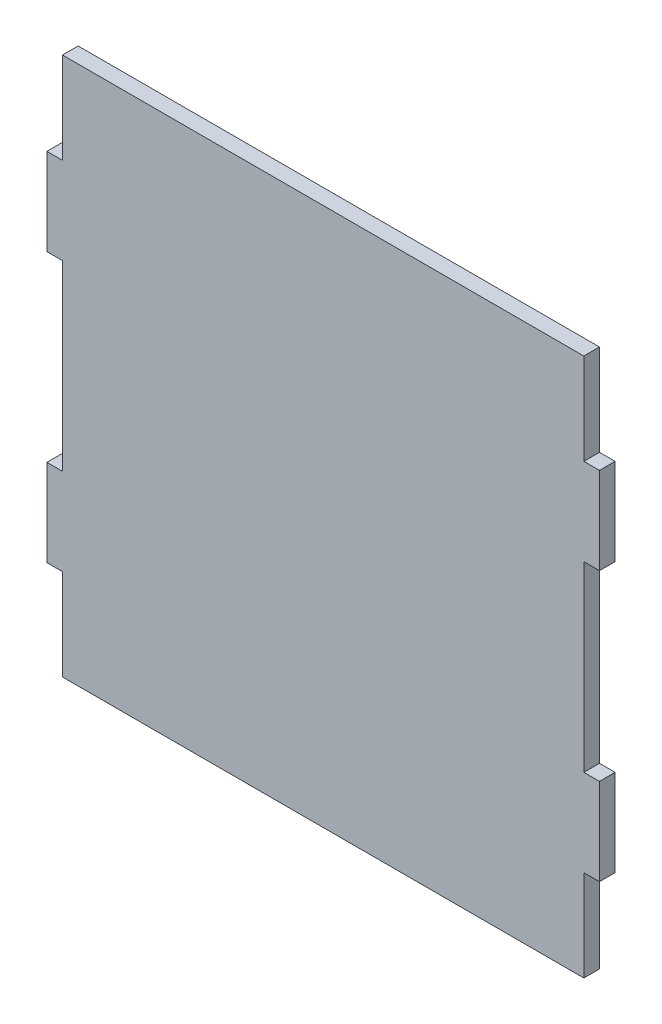
ISO-10303-21;
HEADER;
FILE_DESCRIPTION(('STEP AP214'),'2;1');
FILE_NAME('part.step','',(''),(''),'','','');
FILE_SCHEMA(('AUTOMOTIVE_DESIGN { 1 0 10303 214 1 1 1 1 }'));
ENDSEC;
DATA;
#1=APPLICATION_CONTEXT('core data for automotive mechanical design processes');
#2=APPLICATION_PROTOCOL_DEFINITION('international standard','automotive_design',2000,#1);
#3=PRODUCT_CONTEXT('',#1,'mechanical');
#4=PRODUCT('Part','Part','',(#3));
#5=PRODUCT_RELATED_PRODUCT_CATEGORY('part','',(#4));
#6=PRODUCT_DEFINITION_FORMATION('','',#4);
#7=PRODUCT_DEFINITION_CONTEXT('part definition',#1,'design');
#8=PRODUCT_DEFINITION('design','',#6,#7);
#9=PRODUCT_DEFINITION_SHAPE('','',#8);
#10=(LENGTH_UNIT() NAMED_UNIT(*) SI_UNIT(.MILLI.,.METRE.));
#11=(NAMED_UNIT(*) PLANE_ANGLE_UNIT() SI_UNIT($,.RADIAN.));
#12=(NAMED_UNIT(*) SI_UNIT($,.STERADIAN.) SOLID_ANGLE_UNIT());
#13=UNCERTAINTY_MEASURE_WITH_UNIT(LENGTH_MEASURE(1.E-05),#10,'distance_accuracy_value','');
#14=(GEOMETRIC_REPRESENTATION_CONTEXT(3) GLOBAL_UNCERTAINTY_ASSIGNED_CONTEXT((#13)) GLOBAL_UNIT_ASSIGNED_CONTEXT((#10,
#11,#12)) REPRESENTATION_CONTEXT('',''));
#15=CARTESIAN_POINT('',(0.,0.,0.));
#16=DIRECTION('',(0.,0.,1.));
#17=DIRECTION('',(1.,0.,0.));
#18=AXIS2_PLACEMENT_3D('',#15,#16,#17);
#19=CARTESIAN_POINT('',(0.,0.,18.));
#20=DIRECTION('',(1.,0.,0.));
#21=DIRECTION('',(0.,1.,0.));
#22=AXIS2_PLACEMENT_3D('',#19,#20,#21);
#23=PLANE('',#22);
#24=DIRECTION('',(0.,-1.,0.));
#25=VECTOR('',#24,1.);
#26=CARTESIAN_POINT('',(0.,0.,0.));
#27=LINE('',#26,#25);
#28=CARTESIAN_POINT('',(0.,0.,0.));
#29=VERTEX_POINT('',#28);
#30=CARTESIAN_POINT('',(0.,-105.,0.));
#31=VERTEX_POINT('',#30);
#32=EDGE_CURVE('E199',#29,#31,#27,.T.);
#33=ORIENTED_EDGE('',*,*,#32,.T.);
#34=DIRECTION('',(0.,0.,-1.));
#35=VECTOR('',#34,1.);
#36=CARTESIAN_POINT('',(0.,-105.,18.));
#37=LINE('',#36,#35);
#38=CARTESIAN_POINT('',(0.,-105.,18.));
#39=VERTEX_POINT('',#38);
#40=EDGE_CURVE('E11',#39,#31,#37,.T.);
#41=ORIENTED_EDGE('',*,*,#40,.F.);
#42=DIRECTION('',(0.,-1.,0.));
#43=VECTOR('',#42,1.);
#44=CARTESIAN_POINT('',(0.,0.,18.));
#45=LINE('',#44,#43);
#46=CARTESIAN_POINT('',(0.,0.,18.));
#47=VERTEX_POINT('',#46);
#48=EDGE_CURVE('E121',#47,#39,#45,.T.);
#49=ORIENTED_EDGE('',*,*,#48,.F.);
#50=DIRECTION('',(0.,0.,-1.));
#51=VECTOR('',#50,1.);
#52=CARTESIAN_POINT('',(0.,0.,18.));
#53=LINE('',#52,#51);
#54=EDGE_CURVE('E48',#47,#29,#53,.T.);
#55=ORIENTED_EDGE('',*,*,#54,.T.);
#56=EDGE_LOOP('',(#33,#41,#49,#55));
#57=FACE_BOUND('',#56,.T.);
#58=ADVANCED_FACE('F32',(#57),#23,.F.);
#59=CARTESIAN_POINT('',(-18.,-105.,18.));
#60=DIRECTION('',(0.,1.,0.));
#61=DIRECTION('',(0.,0.,1.));
#62=AXIS2_PLACEMENT_3D('',#59,#60,#61);
#63=PLANE('',#62);
#64=DIRECTION('',(1.,0.,0.));
#65=VECTOR('',#64,1.);
#66=CARTESIAN_POINT('',(-18.,-105.,0.));
#67=LINE('',#66,#65);
#68=CARTESIAN_POINT('',(-18.,-105.,0.));
#69=VERTEX_POINT('',#68);
#70=EDGE_CURVE('E201',#69,#31,#67,.T.);
#71=ORIENTED_EDGE('',*,*,#70,.F.);
#72=DIRECTION('',(0.,0.,-1.));
#73=VECTOR('',#72,1.);
#74=CARTESIAN_POINT('',(-18.,-105.,18.));
#75=LINE('',#74,#73);
#76=CARTESIAN_POINT('',(-18.,-105.,18.));
#77=VERTEX_POINT('',#76);
#78=EDGE_CURVE('E40',#77,#69,#75,.T.);
#79=ORIENTED_EDGE('',*,*,#78,.F.);
#80=DIRECTION('',(1.,0.,0.));
#81=VECTOR('',#80,1.);
#82=CARTESIAN_POINT('',(-18.,-105.,18.));
#83=LINE('',#82,#81);
#84=EDGE_CURVE('E299',#77,#39,#83,.T.);
#85=ORIENTED_EDGE('',*,*,#84,.T.);
#86=ORIENTED_EDGE('',*,*,#40,.T.);
#87=EDGE_LOOP('',(#71,#79,#85,#86));
#88=FACE_BOUND('',#87,.T.);
#89=ADVANCED_FACE('F298',(#88),#63,.T.);
#90=CARTESIAN_POINT('',(-18.,-105.,18.));
#91=DIRECTION('',(1.,0.,0.));
#92=DIRECTION('',(0.,1.,0.));
#93=AXIS2_PLACEMENT_3D('',#90,#91,#92);
#94=PLANE('',#93);
#95=DIRECTION('',(0.,-1.,0.));
#96=VECTOR('',#95,1.);
#97=CARTESIAN_POINT('',(-18.,-105.,0.));
#98=LINE('',#97,#96);
#99=CARTESIAN_POINT('',(-18.,-205.,0.));
#100=VERTEX_POINT('',#99);
#101=EDGE_CURVE('E204',#69,#100,#98,.T.);
#102=ORIENTED_EDGE('',*,*,#101,.T.);
#103=DIRECTION('',(0.,0.,-1.));
#104=VECTOR('',#103,1.);
#105=CARTESIAN_POINT('',(-18.,-205.,18.));
#106=LINE('',#105,#104);
#107=CARTESIAN_POINT('',(-18.,-205.,18.));
#108=VERTEX_POINT('',#107);
#109=EDGE_CURVE('E283',#108,#100,#106,.T.);
#110=ORIENTED_EDGE('',*,*,#109,.F.);
#111=DIRECTION('',(0.,-1.,0.));
#112=VECTOR('',#111,1.);
#113=CARTESIAN_POINT('',(-18.,-105.,18.));
#114=LINE('',#113,#112);
#115=EDGE_CURVE('E290',#77,#108,#114,.T.);
#116=ORIENTED_EDGE('',*,*,#115,.F.);
#117=ORIENTED_EDGE('',*,*,#78,.T.);
#118=EDGE_LOOP('',(#102,#110,#116,#117));
#119=FACE_BOUND('',#118,.T.);
#120=ADVANCED_FACE('F288',(#119),#94,.F.);
#121=CARTESIAN_POINT('',(-18.,-205.,18.));
#122=DIRECTION('',(0.,1.,0.));
#123=DIRECTION('',(0.,0.,1.));
#124=AXIS2_PLACEMENT_3D('',#121,#122,#123);
#125=PLANE('',#124);
#126=DIRECTION('',(1.,0.,0.));
#127=VECTOR('',#126,1.);
#128=CARTESIAN_POINT('',(-18.,-205.,0.));
#129=LINE('',#128,#127);
#130=CARTESIAN_POINT('',(0.,-205.,0.));
#131=VERTEX_POINT('',#130);
#132=EDGE_CURVE('E206',#100,#131,#129,.T.);
#133=ORIENTED_EDGE('',*,*,#132,.T.);
#134=DIRECTION('',(0.,0.,-1.));
#135=VECTOR('',#134,1.);
#136=CARTESIAN_POINT('',(0.,-205.,18.));
#137=LINE('',#136,#135);
#138=CARTESIAN_POINT('',(0.,-205.,18.));
#139=VERTEX_POINT('',#138);
#140=EDGE_CURVE('E280',#139,#131,#137,.T.);
#141=ORIENTED_EDGE('',*,*,#140,.F.);
#142=DIRECTION('',(1.,0.,0.));
#143=VECTOR('',#142,1.);
#144=CARTESIAN_POINT('',(-18.,-205.,18.));
#145=LINE('',#144,#143);
#146=EDGE_CURVE('E546',#108,#139,#145,.T.);
#147=ORIENTED_EDGE('',*,*,#146,.F.);
#148=ORIENTED_EDGE('',*,*,#109,.T.);
#149=EDGE_LOOP('',(#133,#141,#147,#148));
#150=FACE_BOUND('',#149,.T.);
#151=ADVANCED_FACE('F317',(#150),#125,.F.);
#152=CARTESIAN_POINT('',(0.,-205.,18.));
#153=DIRECTION('',(1.,0.,0.));
#154=DIRECTION('',(0.,1.,0.));
#155=AXIS2_PLACEMENT_3D('',#152,#153,#154);
#156=PLANE('',#155);
#157=DIRECTION('',(0.,-1.,0.));
#158=VECTOR('',#157,1.);
#159=CARTESIAN_POINT('',(0.,-205.,0.));
#160=LINE('',#159,#158);
#161=CARTESIAN_POINT('',(0.,-415.,0.));
#162=VERTEX_POINT('',#161);
#163=EDGE_CURVE('E208',#131,#162,#160,.T.);
#164=ORIENTED_EDGE('',*,*,#163,.T.);
#165=DIRECTION('',(0.,0.,-1.));
#166=VECTOR('',#165,1.);
#167=CARTESIAN_POINT('',(0.,-415.,18.));
#168=LINE('',#167,#166);
#169=CARTESIAN_POINT('',(0.,-415.,18.));
#170=VERTEX_POINT('',#169);
#171=EDGE_CURVE('E278',#170,#162,#168,.T.);
#172=ORIENTED_EDGE('',*,*,#171,.F.);
#173=DIRECTION('',(0.,-1.,0.));
#174=VECTOR('',#173,1.);
#175=CARTESIAN_POINT('',(0.,-205.,18.));
#176=LINE('',#175,#174);
#177=EDGE_CURVE('E544',#139,#170,#176,.T.);
#178=ORIENTED_EDGE('',*,*,#177,.F.);
#179=ORIENTED_EDGE('',*,*,#140,.T.);
#180=EDGE_LOOP('',(#164,#172,#178,#179));
#181=FACE_BOUND('',#180,.T.);
#182=ADVANCED_FACE('F322',(#181),#156,.F.);
#183=CARTESIAN_POINT('',(-18.,-415.,18.));
#184=DIRECTION('',(0.,1.,0.));
#185=DIRECTION('',(0.,0.,1.));
#186=AXIS2_PLACEMENT_3D('',#183,#184,#185);
#187=PLANE('',#186);
#188=DIRECTION('',(1.,0.,0.));
#189=VECTOR('',#188,1.);
#190=CARTESIAN_POINT('',(-18.,-415.,0.));
#191=LINE('',#190,#189);
#192=CARTESIAN_POINT('',(-18.,-415.,0.));
#193=VERTEX_POINT('',#192);
#194=EDGE_CURVE('E211',#193,#162,#191,.T.);
#195=ORIENTED_EDGE('',*,*,#194,.F.);
#196=DIRECTION('',(0.,0.,-1.));
#197=VECTOR('',#196,1.);
#198=CARTESIAN_POINT('',(-18.,-415.,18.));
#199=LINE('',#198,#197);
#200=CARTESIAN_POINT('',(-18.,-415.,18.));
#201=VERTEX_POINT('',#200);
#202=EDGE_CURVE('E276',#201,#193,#199,.T.);
#203=ORIENTED_EDGE('',*,*,#202,.F.);
#204=DIRECTION('',(1.,0.,0.));
#205=VECTOR('',#204,1.);
#206=CARTESIAN_POINT('',(-18.,-415.,18.));
#207=LINE('',#206,#205);
#208=EDGE_CURVE('E548',#201,#170,#207,.T.);
#209=ORIENTED_EDGE('',*,*,#208,.T.);
#210=ORIENTED_EDGE('',*,*,#171,.T.);
#211=EDGE_LOOP('',(#195,#203,#209,#210));
#212=FACE_BOUND('',#211,.T.);
#213=ADVANCED_FACE('F326',(#212),#187,.T.);
#214=CARTESIAN_POINT('',(-18.,-515.,18.));
#215=DIRECTION('',(-1.,0.,0.));
#216=DIRECTION('',(0.,0.,1.));
#217=AXIS2_PLACEMENT_3D('',#214,#215,#216);
#218=PLANE('',#217);
#219=DIRECTION('',(0.,1.,0.));
#220=VECTOR('',#219,1.);
#221=CARTESIAN_POINT('',(-18.,-515.,0.));
#222=LINE('',#221,#220);
#223=CARTESIAN_POINT('',(-18.,-515.,0.));
#224=VERTEX_POINT('',#223);
#225=EDGE_CURVE('E214',#224,#193,#222,.T.);
#226=ORIENTED_EDGE('',*,*,#225,.F.);
#227=DIRECTION('',(0.,0.,-1.));
#228=VECTOR('',#227,1.);
#229=CARTESIAN_POINT('',(-18.,-515.,18.));
#230=LINE('',#229,#228);
#231=CARTESIAN_POINT('',(-18.,-515.,18.));
#232=VERTEX_POINT('',#231);
#233=EDGE_CURVE('E274',#232,#224,#230,.T.);
#234=ORIENTED_EDGE('',*,*,#233,.F.);
#235=DIRECTION('',(0.,1.,0.));
#236=VECTOR('',#235,1.);
#237=CARTESIAN_POINT('',(-18.,-515.,18.));
#238=LINE('',#237,#236);
#239=EDGE_CURVE('E538',#232,#201,#238,.T.);
#240=ORIENTED_EDGE('',*,*,#239,.T.);
#241=ORIENTED_EDGE('',*,*,#202,.T.);
#242=EDGE_LOOP('',(#226,#234,#240,#241));
#243=FACE_BOUND('',#242,.T.);
#244=ADVANCED_FACE('F330',(#243),#218,.T.);
#245=CARTESIAN_POINT('',(-18.,-515.,18.));
#246=DIRECTION('',(0.,1.,0.));
#247=DIRECTION('',(0.,0.,1.));
#248=AXIS2_PLACEMENT_3D('',#245,#246,#247);
#249=PLANE('',#248);
#250=DIRECTION('',(1.,0.,0.));
#251=VECTOR('',#250,1.);
#252=CARTESIAN_POINT('',(-18.,-515.,0.));
#253=LINE('',#252,#251);
#254=CARTESIAN_POINT('',(0.,-515.,0.));
#255=VERTEX_POINT('',#254);
#256=EDGE_CURVE('E217',#224,#255,#253,.T.);
#257=ORIENTED_EDGE('',*,*,#256,.T.);
#258=DIRECTION('',(0.,0.,-1.));
#259=VECTOR('',#258,1.);
#260=CARTESIAN_POINT('',(0.,-515.,18.));
#261=LINE('',#260,#259);
#262=CARTESIAN_POINT('',(0.,-515.,18.));
#263=VERTEX_POINT('',#262);
#264=EDGE_CURVE('E272',#263,#255,#261,.T.);
#265=ORIENTED_EDGE('',*,*,#264,.F.);
#266=DIRECTION('',(1.,0.,0.));
#267=VECTOR('',#266,1.);
#268=CARTESIAN_POINT('',(-18.,-515.,18.));
#269=LINE('',#268,#267);
#270=EDGE_CURVE('E555',#232,#263,#269,.T.);
#271=ORIENTED_EDGE('',*,*,#270,.F.);
#272=ORIENTED_EDGE('',*,*,#233,.T.);
#273=EDGE_LOOP('',(#257,#265,#271,#272));
#274=FACE_BOUND('',#273,.T.);
#275=ADVANCED_FACE('F334',(#274),#249,.F.);
#276=CARTESIAN_POINT('',(0.,-620.,18.));
#277=DIRECTION('',(-1.,0.,0.));
#278=DIRECTION('',(0.,-1.,0.));
#279=AXIS2_PLACEMENT_3D('',#276,#277,#278);
#280=PLANE('',#279);
#281=DIRECTION('',(0.,1.,0.));
#282=VECTOR('',#281,1.);
#283=CARTESIAN_POINT('',(0.,-620.,0.));
#284=LINE('',#283,#282);
#285=CARTESIAN_POINT('',(0.,-620.,0.));
#286=VERTEX_POINT('',#285);
#287=EDGE_CURVE('E220',#286,#255,#284,.T.);
#288=ORIENTED_EDGE('',*,*,#287,.F.);
#289=DIRECTION('',(0.,0.,-1.));
#290=VECTOR('',#289,1.);
#291=CARTESIAN_POINT('',(0.,-620.,18.));
#292=LINE('',#291,#290);
#293=CARTESIAN_POINT('',(0.,-620.,18.));
#294=VERTEX_POINT('',#293);
#295=EDGE_CURVE('E270',#294,#286,#292,.T.);
#296=ORIENTED_EDGE('',*,*,#295,.F.);
#297=DIRECTION('',(0.,1.,0.));
#298=VECTOR('',#297,1.);
#299=CARTESIAN_POINT('',(0.,-620.,18.));
#300=LINE('',#299,#298);
#301=EDGE_CURVE('E532',#294,#263,#300,.T.);
#302=ORIENTED_EDGE('',*,*,#301,.T.);
#303=ORIENTED_EDGE('',*,*,#264,.T.);
#304=EDGE_LOOP('',(#288,#296,#302,#303));
#305=FACE_BOUND('',#304,.T.);
#306=ADVANCED_FACE('F338',(#305),#280,.T.);
#307=CARTESIAN_POINT('',(0.,-620.,18.));
#308=DIRECTION('',(0.,1.,0.));
#309=DIRECTION('',(-1.,0.,0.));
#310=AXIS2_PLACEMENT_3D('',#307,#308,#309);
#311=PLANE('',#310);
#312=DIRECTION('',(1.,0.,0.));
#313=VECTOR('',#312,1.);
#314=CARTESIAN_POINT('',(0.,-620.,0.));
#315=LINE('',#314,#313);
#316=CARTESIAN_POINT('',(600.,-620.,0.));
#317=VERTEX_POINT('',#316);
#318=EDGE_CURVE('E223',#286,#317,#315,.T.);
#319=ORIENTED_EDGE('',*,*,#318,.T.);
#320=DIRECTION('',(0.,0.,-1.));
#321=VECTOR('',#320,1.);
#322=CARTESIAN_POINT('',(600.,-620.,18.));
#323=LINE('',#322,#321);
#324=CARTESIAN_POINT('',(600.,-620.,18.));
#325=VERTEX_POINT('',#324);
#326=EDGE_CURVE('E267',#325,#317,#323,.T.);
#327=ORIENTED_EDGE('',*,*,#326,.F.);
#328=DIRECTION('',(1.,0.,0.));
#329=VECTOR('',#328,1.);
#330=CARTESIAN_POINT('',(0.,-620.,18.));
#331=LINE('',#330,#329);
#332=EDGE_CURVE('E558',#294,#325,#331,.T.);
#333=ORIENTED_EDGE('',*,*,#332,.F.);
#334=ORIENTED_EDGE('',*,*,#295,.T.);
#335=EDGE_LOOP('',(#319,#327,#333,#334));
#336=FACE_BOUND('',#335,.T.);
#337=ADVANCED_FACE('F342',(#336),#311,.F.);
#338=CARTESIAN_POINT('',(600.,-620.,18.));
#339=DIRECTION('',(-1.,0.,0.));
#340=DIRECTION('',(0.,0.,1.));
#341=AXIS2_PLACEMENT_3D('',#338,#339,#340);
#342=PLANE('',#341);
#343=DIRECTION('',(0.,1.,0.));
#344=VECTOR('',#343,1.);
#345=CARTESIAN_POINT('',(600.,-620.,0.));
#346=LINE('',#345,#344);
#347=CARTESIAN_POINT('',(600.,-515.,0.));
#348=VERTEX_POINT('',#347);
#349=EDGE_CURVE('E225',#317,#348,#346,.T.);
#350=ORIENTED_EDGE('',*,*,#349,.T.);
#351=DIRECTION('',(0.,0.,-1.));
#352=VECTOR('',#351,1.);
#353=CARTESIAN_POINT('',(600.,-515.,18.));
#354=LINE('',#353,#352);
#355=CARTESIAN_POINT('',(600.,-515.,18.));
#356=VERTEX_POINT('',#355);
#357=EDGE_CURVE('E265',#356,#348,#354,.T.);
#358=ORIENTED_EDGE('',*,*,#357,.F.);
#359=DIRECTION('',(0.,1.,0.));
#360=VECTOR('',#359,1.);
#361=CARTESIAN_POINT('',(600.,-620.,18.));
#362=LINE('',#361,#360);
#363=EDGE_CURVE('E560',#325,#356,#362,.T.);
#364=ORIENTED_EDGE('',*,*,#363,.F.);
#365=ORIENTED_EDGE('',*,*,#326,.T.);
#366=EDGE_LOOP('',(#350,#358,#364,#365));
#367=FACE_BOUND('',#366,.T.);
#368=ADVANCED_FACE('F346',(#367),#342,.F.);
#369=CARTESIAN_POINT('',(618.,-515.,18.));
#370=DIRECTION('',(0.,-1.,0.));
#371=DIRECTION('',(1.,0.,0.));
#372=AXIS2_PLACEMENT_3D('',#369,#370,#371);
#373=PLANE('',#372);
#374=DIRECTION('',(-1.,0.,0.));
#375=VECTOR('',#374,1.);
#376=CARTESIAN_POINT('',(618.,-515.,0.));
#377=LINE('',#376,#375);
#378=CARTESIAN_POINT('',(618.,-515.,0.));
#379=VERTEX_POINT('',#378);
#380=EDGE_CURVE('E228',#379,#348,#377,.T.);
#381=ORIENTED_EDGE('',*,*,#380,.F.);
#382=DIRECTION('',(0.,0.,-1.));
#383=VECTOR('',#382,1.);
#384=CARTESIAN_POINT('',(618.,-515.,18.));
#385=LINE('',#384,#383);
#386=CARTESIAN_POINT('',(618.,-515.,18.));
#387=VERTEX_POINT('',#386);
#388=EDGE_CURVE('E263',#387,#379,#385,.T.);
#389=ORIENTED_EDGE('',*,*,#388,.F.);
#390=DIRECTION('',(-1.,0.,0.));
#391=VECTOR('',#390,1.);
#392=CARTESIAN_POINT('',(618.,-515.,18.));
#393=LINE('',#392,#391);
#394=EDGE_CURVE('E522',#387,#356,#393,.T.);
#395=ORIENTED_EDGE('',*,*,#394,.T.);
#396=ORIENTED_EDGE('',*,*,#357,.T.);
#397=EDGE_LOOP('',(#381,#389,#395,#396));
#398=FACE_BOUND('',#397,.T.);
#399=ADVANCED_FACE('F350',(#398),#373,.T.);
#400=CARTESIAN_POINT('',(618.,-515.,18.));
#401=DIRECTION('',(-1.,0.,0.));
#402=DIRECTION('',(0.,0.,1.));
#403=AXIS2_PLACEMENT_3D('',#400,#401,#402);
#404=PLANE('',#403);
#405=DIRECTION('',(0.,1.,0.));
#406=VECTOR('',#405,1.);
#407=CARTESIAN_POINT('',(618.,-515.,0.));
#408=LINE('',#407,#406);
#409=CARTESIAN_POINT('',(618.,-415.,0.));
#410=VERTEX_POINT('',#409);
#411=EDGE_CURVE('E231',#379,#410,#408,.T.);
#412=ORIENTED_EDGE('',*,*,#411,.T.);
#413=DIRECTION('',(0.,0.,-1.));
#414=VECTOR('',#413,1.);
#415=CARTESIAN_POINT('',(618.,-415.,18.));
#416=LINE('',#415,#414);
#417=CARTESIAN_POINT('',(618.,-415.,18.));
#418=VERTEX_POINT('',#417);
#419=EDGE_CURVE('E260',#418,#410,#416,.T.);
#420=ORIENTED_EDGE('',*,*,#419,.F.);
#421=DIRECTION('',(0.,1.,0.));
#422=VECTOR('',#421,1.);
#423=CARTESIAN_POINT('',(618.,-515.,18.));
#424=LINE('',#423,#422);
#425=EDGE_CURVE('E563',#387,#418,#424,.T.);
#426=ORIENTED_EDGE('',*,*,#425,.F.);
#427=ORIENTED_EDGE('',*,*,#388,.T.);
#428=EDGE_LOOP('',(#412,#420,#426,#427));
#429=FACE_BOUND('',#428,.T.);
#430=ADVANCED_FACE('F354',(#429),#404,.F.);
#431=CARTESIAN_POINT('',(618.,-415.,18.));
#432=DIRECTION('',(0.,-1.,0.));
#433=DIRECTION('',(0.,0.,-1.));
#434=AXIS2_PLACEMENT_3D('',#431,#432,#433);
#435=PLANE('',#434);
#436=DIRECTION('',(-1.,0.,0.));
#437=VECTOR('',#436,1.);
#438=CARTESIAN_POINT('',(618.,-415.,0.));
#439=LINE('',#438,#437);
#440=CARTESIAN_POINT('',(600.,-415.,0.));
#441=VERTEX_POINT('',#440);
#442=EDGE_CURVE('E233',#410,#441,#439,.T.);
#443=ORIENTED_EDGE('',*,*,#442,.T.);
#444=DIRECTION('',(0.,0.,-1.));
#445=VECTOR('',#444,1.);
#446=CARTESIAN_POINT('',(600.,-415.,18.));
#447=LINE('',#446,#445);
#448=CARTESIAN_POINT('',(600.,-415.,18.));
#449=VERTEX_POINT('',#448);
#450=EDGE_CURVE('E258',#449,#441,#447,.T.);
#451=ORIENTED_EDGE('',*,*,#450,.F.);
#452=DIRECTION('',(-1.,0.,0.));
#453=VECTOR('',#452,1.);
#454=CARTESIAN_POINT('',(618.,-415.,18.));
#455=LINE('',#454,#453);
#456=EDGE_CURVE('E565',#418,#449,#455,.T.);
#457=ORIENTED_EDGE('',*,*,#456,.F.);
#458=ORIENTED_EDGE('',*,*,#419,.T.);
#459=EDGE_LOOP('',(#443,#451,#457,#458));
#460=FACE_BOUND('',#459,.T.);
#461=ADVANCED_FACE('F358',(#460),#435,.F.);
#462=CARTESIAN_POINT('',(600.,-205.,18.));
#463=DIRECTION('',(1.,0.,0.));
#464=DIRECTION('',(0.,1.,0.));
#465=AXIS2_PLACEMENT_3D('',#462,#463,#464);
#466=PLANE('',#465);
#467=DIRECTION('',(0.,-1.,0.));
#468=VECTOR('',#467,1.);
#469=CARTESIAN_POINT('',(600.,-205.,0.));
#470=LINE('',#469,#468);
#471=CARTESIAN_POINT('',(600.,-205.,0.));
#472=VERTEX_POINT('',#471);
#473=EDGE_CURVE('E236',#472,#441,#470,.T.);
#474=ORIENTED_EDGE('',*,*,#473,.F.);
#475=DIRECTION('',(0.,0.,-1.));
#476=VECTOR('',#475,1.);
#477=CARTESIAN_POINT('',(600.,-205.,18.));
#478=LINE('',#477,#476);
#479=CARTESIAN_POINT('',(600.,-205.,18.));
#480=VERTEX_POINT('',#479);
#481=EDGE_CURVE('E256',#480,#472,#478,.T.);
#482=ORIENTED_EDGE('',*,*,#481,.F.);
#483=DIRECTION('',(0.,-1.,0.));
#484=VECTOR('',#483,1.);
#485=CARTESIAN_POINT('',(600.,-205.,18.));
#486=LINE('',#485,#484);
#487=EDGE_CURVE('E512',#480,#449,#486,.T.);
#488=ORIENTED_EDGE('',*,*,#487,.T.);
#489=ORIENTED_EDGE('',*,*,#450,.T.);
#490=EDGE_LOOP('',(#474,#482,#488,#489));
#491=FACE_BOUND('',#490,.T.);
#492=ADVANCED_FACE('F362',(#491),#466,.T.);
#493=CARTESIAN_POINT('',(618.,-205.,18.));
#494=DIRECTION('',(0.,-1.,0.));
#495=DIRECTION('',(0.,0.,-1.));
#496=AXIS2_PLACEMENT_3D('',#493,#494,#495);
#497=PLANE('',#496);
#498=DIRECTION('',(-1.,0.,0.));
#499=VECTOR('',#498,1.);
#500=CARTESIAN_POINT('',(618.,-205.,0.));
#501=LINE('',#500,#499);
#502=CARTESIAN_POINT('',(618.,-205.,0.));
#503=VERTEX_POINT('',#502);
#504=EDGE_CURVE('E239',#503,#472,#501,.T.);
#505=ORIENTED_EDGE('',*,*,#504,.F.);
#506=DIRECTION('',(0.,0.,-1.));
#507=VECTOR('',#506,1.);
#508=CARTESIAN_POINT('',(618.,-205.,18.));
#509=LINE('',#508,#507);
#510=CARTESIAN_POINT('',(618.,-205.,18.));
#511=VERTEX_POINT('',#510);
#512=EDGE_CURVE('E254',#511,#503,#509,.T.);
#513=ORIENTED_EDGE('',*,*,#512,.F.);
#514=DIRECTION('',(-1.,0.,0.));
#515=VECTOR('',#514,1.);
#516=CARTESIAN_POINT('',(618.,-205.,18.));
#517=LINE('',#516,#515);
#518=EDGE_CURVE('E508',#511,#480,#517,.T.);
#519=ORIENTED_EDGE('',*,*,#518,.T.);
#520=ORIENTED_EDGE('',*,*,#481,.T.);
#521=EDGE_LOOP('',(#505,#513,#519,#520));
#522=FACE_BOUND('',#521,.T.);
#523=ADVANCED_FACE('F366',(#522),#497,.T.);
#524=CARTESIAN_POINT('',(618.,-105.,18.));
#525=DIRECTION('',(1.,0.,0.));
#526=DIRECTION('',(0.,0.,-1.));
#527=AXIS2_PLACEMENT_3D('',#524,#525,#526);
#528=PLANE('',#527);
#529=DIRECTION('',(0.,-1.,0.));
#530=VECTOR('',#529,1.);
#531=CARTESIAN_POINT('',(618.,-105.,0.));
#532=LINE('',#531,#530);
#533=CARTESIAN_POINT('',(618.,-105.,0.));
#534=VERTEX_POINT('',#533);
#535=EDGE_CURVE('E242',#534,#503,#532,.T.);
#536=ORIENTED_EDGE('',*,*,#535,.F.);
#537=DIRECTION('',(0.,0.,-1.));
#538=VECTOR('',#537,1.);
#539=CARTESIAN_POINT('',(618.,-105.,18.));
#540=LINE('',#539,#538);
#541=CARTESIAN_POINT('',(618.,-105.,18.));
#542=VERTEX_POINT('',#541);
#543=EDGE_CURVE('E191',#542,#534,#540,.T.);
#544=ORIENTED_EDGE('',*,*,#543,.F.);
#545=DIRECTION('',(0.,-1.,0.));
#546=VECTOR('',#545,1.);
#547=CARTESIAN_POINT('',(618.,-105.,18.));
#548=LINE('',#547,#546);
#549=EDGE_CURVE('E181',#542,#511,#548,.T.);
#550=ORIENTED_EDGE('',*,*,#549,.T.);
#551=ORIENTED_EDGE('',*,*,#512,.T.);
#552=EDGE_LOOP('',(#536,#544,#550,#551));
#553=FACE_BOUND('',#552,.T.);
#554=ADVANCED_FACE('F370',(#553),#528,.T.);
#555=CARTESIAN_POINT('',(618.,-105.,18.));
#556=DIRECTION('',(0.,-1.,0.));
#557=DIRECTION('',(0.,0.,-1.));
#558=AXIS2_PLACEMENT_3D('',#555,#556,#557);
#559=PLANE('',#558);
#560=DIRECTION('',(-1.,0.,0.));
#561=VECTOR('',#560,1.);
#562=CARTESIAN_POINT('',(618.,-105.,0.));
#563=LINE('',#562,#561);
#564=CARTESIAN_POINT('',(600.,-105.,0.));
#565=VERTEX_POINT('',#564);
#566=EDGE_CURVE('E188',#534,#565,#563,.T.);
#567=ORIENTED_EDGE('',*,*,#566,.T.);
#568=DIRECTION('',(0.,0.,-1.));
#569=VECTOR('',#568,1.);
#570=CARTESIAN_POINT('',(600.,-105.,18.));
#571=LINE('',#570,#569);
#572=CARTESIAN_POINT('',(600.,-105.,18.));
#573=VERTEX_POINT('',#572);
#574=EDGE_CURVE('E185',#573,#565,#571,.T.);
#575=ORIENTED_EDGE('',*,*,#574,.F.);
#576=DIRECTION('',(-1.,0.,0.));
#577=VECTOR('',#576,1.);
#578=CARTESIAN_POINT('',(618.,-105.,18.));
#579=LINE('',#578,#577);
#580=EDGE_CURVE('E174',#542,#573,#579,.T.);
#581=ORIENTED_EDGE('',*,*,#580,.F.);
#582=ORIENTED_EDGE('',*,*,#543,.T.);
#583=EDGE_LOOP('',(#567,#575,#581,#582));
#584=FACE_BOUND('',#583,.T.);
#585=ADVANCED_FACE('F186',(#584),#559,.F.);
#586=CARTESIAN_POINT('',(600.,0.,18.));
#587=DIRECTION('',(1.,0.,0.));
#588=DIRECTION('',(0.,0.,-1.));
#589=AXIS2_PLACEMENT_3D('',#586,#587,#588);
#590=PLANE('',#589);
#591=DIRECTION('',(0.,-1.,0.));
#592=VECTOR('',#591,1.);
#593=CARTESIAN_POINT('',(600.,0.,0.));
#594=LINE('',#593,#592);
#595=CARTESIAN_POINT('',(600.,0.,0.));
#596=VERTEX_POINT('',#595);
#597=EDGE_CURVE('E246',#596,#565,#594,.T.);
#598=ORIENTED_EDGE('',*,*,#597,.F.);
#599=DIRECTION('',(0.,0.,-1.));
#600=VECTOR('',#599,1.);
#601=CARTESIAN_POINT('',(600.,0.,18.));
#602=LINE('',#601,#600);
#603=CARTESIAN_POINT('',(600.,0.,18.));
#604=VERTEX_POINT('',#603);
#605=EDGE_CURVE('E109',#604,#596,#602,.T.);
#606=ORIENTED_EDGE('',*,*,#605,.F.);
#607=DIRECTION('',(0.,-1.,0.));
#608=VECTOR('',#607,1.);
#609=CARTESIAN_POINT('',(600.,0.,18.));
#610=LINE('',#609,#608);
#611=EDGE_CURVE('E178',#604,#573,#610,.T.);
#612=ORIENTED_EDGE('',*,*,#611,.T.);
#613=ORIENTED_EDGE('',*,*,#574,.T.);
#614=EDGE_LOOP('',(#598,#606,#612,#613));
#615=FACE_BOUND('',#614,.T.);
#616=ADVANCED_FACE('F193',(#615),#590,.T.);
#617=CARTESIAN_POINT('',(0.,0.,18.));
#618=DIRECTION('',(0.,1.,0.));
#619=DIRECTION('',(0.,0.,1.));
#620=AXIS2_PLACEMENT_3D('',#617,#618,#619);
#621=PLANE('',#620);
#622=DIRECTION('',(1.,0.,0.));
#623=VECTOR('',#622,1.);
#624=CARTESIAN_POINT('',(0.,0.,0.));
#625=LINE('',#624,#623);
#626=EDGE_CURVE('E248',#29,#596,#625,.T.);
#627=ORIENTED_EDGE('',*,*,#626,.F.);
#628=ORIENTED_EDGE('',*,*,#54,.F.);
#629=DIRECTION('',(1.,0.,0.));
#630=VECTOR('',#629,1.);
#631=CARTESIAN_POINT('',(0.,0.,18.));
#632=LINE('',#631,#630);
#633=EDGE_CURVE('E194',#47,#604,#632,.T.);
#634=ORIENTED_EDGE('',*,*,#633,.T.);
#635=ORIENTED_EDGE('',*,*,#605,.T.);
#636=EDGE_LOOP('',(#627,#628,#634,#635));
#637=FACE_BOUND('',#636,.T.);
#638=ADVANCED_FACE('F300',(#637),#621,.T.);
#639=CARTESIAN_POINT('',(0.,0.,18.));
#640=DIRECTION('',(0.,0.,1.));
#641=DIRECTION('',(1.,0.,0.));
#642=AXIS2_PLACEMENT_3D('',#639,#640,#641);
#643=PLANE('',#642);
#644=ORIENTED_EDGE('',*,*,#48,.T.);
#645=ORIENTED_EDGE('',*,*,#84,.F.);
#646=ORIENTED_EDGE('',*,*,#115,.T.);
#647=ORIENTED_EDGE('',*,*,#146,.T.);
#648=ORIENTED_EDGE('',*,*,#177,.T.);
#649=ORIENTED_EDGE('',*,*,#208,.F.);
#650=ORIENTED_EDGE('',*,*,#239,.F.);
#651=ORIENTED_EDGE('',*,*,#270,.T.);
#652=ORIENTED_EDGE('',*,*,#301,.F.);
#653=ORIENTED_EDGE('',*,*,#332,.T.);
#654=ORIENTED_EDGE('',*,*,#363,.T.);
#655=ORIENTED_EDGE('',*,*,#394,.F.);
#656=ORIENTED_EDGE('',*,*,#425,.T.);
#657=ORIENTED_EDGE('',*,*,#456,.T.);
#658=ORIENTED_EDGE('',*,*,#487,.F.);
#659=ORIENTED_EDGE('',*,*,#518,.F.);
#660=ORIENTED_EDGE('',*,*,#549,.F.);
#661=ORIENTED_EDGE('',*,*,#580,.T.);
#662=ORIENTED_EDGE('',*,*,#611,.F.);
#663=ORIENTED_EDGE('',*,*,#633,.F.);
#664=EDGE_LOOP('',(#644,#645,#646,#647,#648,#649,#650,#651,#652,#653,#654,#655,#656,#657,#658,
#659,#660,#661,#662,#663));
#665=FACE_BOUND('',#664,.T.);
#666=ADVANCED_FACE('F176',(#665),#643,.T.);
#667=CARTESIAN_POINT('',(0.,0.,0.));
#668=DIRECTION('',(0.,0.,1.));
#669=DIRECTION('',(1.,0.,0.));
#670=AXIS2_PLACEMENT_3D('',#667,#668,#669);
#671=PLANE('',#670);
#672=ORIENTED_EDGE('',*,*,#32,.F.);
#673=ORIENTED_EDGE('',*,*,#626,.T.);
#674=ORIENTED_EDGE('',*,*,#597,.T.);
#675=ORIENTED_EDGE('',*,*,#566,.F.);
#676=ORIENTED_EDGE('',*,*,#535,.T.);
#677=ORIENTED_EDGE('',*,*,#504,.T.);
#678=ORIENTED_EDGE('',*,*,#473,.T.);
#679=ORIENTED_EDGE('',*,*,#442,.F.);
#680=ORIENTED_EDGE('',*,*,#411,.F.);
#681=ORIENTED_EDGE('',*,*,#380,.T.);
#682=ORIENTED_EDGE('',*,*,#349,.F.);
#683=ORIENTED_EDGE('',*,*,#318,.F.);
#684=ORIENTED_EDGE('',*,*,#287,.T.);
#685=ORIENTED_EDGE('',*,*,#256,.F.);
#686=ORIENTED_EDGE('',*,*,#225,.T.);
#687=ORIENTED_EDGE('',*,*,#194,.T.);
#688=ORIENTED_EDGE('',*,*,#163,.F.);
#689=ORIENTED_EDGE('',*,*,#132,.F.);
#690=ORIENTED_EDGE('',*,*,#101,.F.);
#691=ORIENTED_EDGE('',*,*,#70,.T.);
#692=EDGE_LOOP('',(#672,#673,#674,#675,#676,#677,#678,#679,#680,#681,#682,#683,#684,#685,#686,
#687,#688,#689,#690,#691));
#693=FACE_BOUND('',#692,.T.);
#694=ADVANCED_FACE('F296',(#693),#671,.F.);
#695=CLOSED_SHELL('',(#58,#89,#120,#151,#182,#213,#244,#275,#306,#337,#368,#399,#430,#461,#492,
#523,#554,#585,#616,#638,#666,#694));
#696=MANIFOLD_SOLID_BREP('B2',#695);
#697=ADVANCED_BREP_SHAPE_REPRESENTATION('',(#18,#696),#14);
#698=SHAPE_DEFINITION_REPRESENTATION(#9,#697);
ENDSEC;
END-ISO-10303-21;
